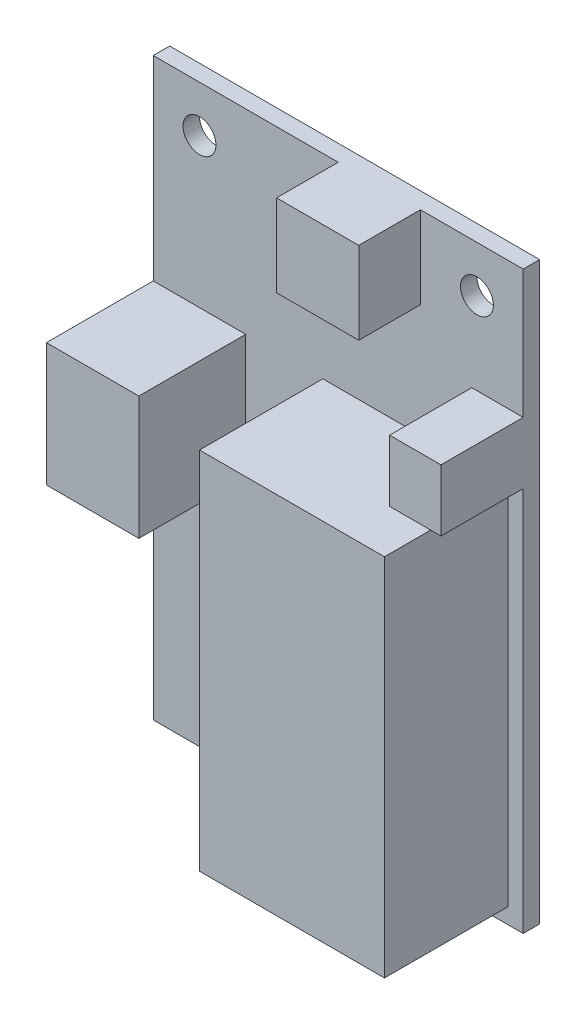
ISO-10303-21;
HEADER;
FILE_DESCRIPTION(('STEP AP214'),'2;1');
FILE_NAME('part.step','',(''),(''),'','','');
FILE_SCHEMA(('AUTOMOTIVE_DESIGN { 1 0 10303 214 1 1 1 1 }'));
ENDSEC;
DATA;
#1=APPLICATION_CONTEXT('core data for automotive mechanical design processes');
#2=APPLICATION_PROTOCOL_DEFINITION('international standard','automotive_design',2000,#1);
#3=PRODUCT_CONTEXT('',#1,'mechanical');
#4=PRODUCT('Part','Part','',(#3));
#5=PRODUCT_RELATED_PRODUCT_CATEGORY('part','',(#4));
#6=PRODUCT_DEFINITION_FORMATION('','',#4);
#7=PRODUCT_DEFINITION_CONTEXT('part definition',#1,'design');
#8=PRODUCT_DEFINITION('design','',#6,#7);
#9=PRODUCT_DEFINITION_SHAPE('','',#8);
#10=(LENGTH_UNIT() NAMED_UNIT(*) SI_UNIT(.MILLI.,.METRE.));
#11=(NAMED_UNIT(*) PLANE_ANGLE_UNIT() SI_UNIT($,.RADIAN.));
#12=(NAMED_UNIT(*) SI_UNIT($,.STERADIAN.) SOLID_ANGLE_UNIT());
#13=UNCERTAINTY_MEASURE_WITH_UNIT(LENGTH_MEASURE(1.E-05),#10,'distance_accuracy_value','');
#14=(GEOMETRIC_REPRESENTATION_CONTEXT(3) GLOBAL_UNCERTAINTY_ASSIGNED_CONTEXT((#13)) GLOBAL_UNIT_ASSIGNED_CONTEXT((#10,
#11,#12)) REPRESENTATION_CONTEXT('',''));
#15=CARTESIAN_POINT('',(0.,0.,0.));
#16=DIRECTION('',(0.,0.,1.));
#17=DIRECTION('',(1.,0.,0.));
#18=AXIS2_PLACEMENT_3D('',#15,#16,#17);
#19=CARTESIAN_POINT('',(0.,0.,1.6));
#20=DIRECTION('',(0.,0.,1.));
#21=DIRECTION('',(1.,0.,0.));
#22=AXIS2_PLACEMENT_3D('',#19,#20,#21);
#23=PLANE('',#22);
#24=CARTESIAN_POINT('',(-31.5,51.5,1.6));
#25=DIRECTION('',(0.,0.,1.));
#26=DIRECTION('',(1.,0.,0.));
#27=AXIS2_PLACEMENT_3D('',#24,#25,#26);
#28=CIRCLE('',#27,1.6);
#29=CARTESIAN_POINT('',(-29.9,51.5,1.6));
#30=VERTEX_POINT('',#29);
#31=EDGE_CURVE('E342',#30,#30,#28,.T.);
#32=ORIENTED_EDGE('',*,*,#31,.F.);
#33=EDGE_LOOP('',(#32));
#34=FACE_BOUND('',#33,.T.);
#35=CARTESIAN_POINT('',(-4.49999999999998,51.5,1.6));
#36=DIRECTION('',(0.,0.,1.));
#37=DIRECTION('',(1.,0.,0.));
#38=AXIS2_PLACEMENT_3D('',#35,#36,#37);
#39=CIRCLE('',#38,1.6);
#40=CARTESIAN_POINT('',(-2.89999999999999,51.5,1.6));
#41=VERTEX_POINT('',#40);
#42=EDGE_CURVE('E334',#41,#41,#39,.T.);
#43=ORIENTED_EDGE('',*,*,#42,.F.);
#44=EDGE_LOOP('',(#43));
#45=FACE_BOUND('',#44,.T.);
#46=DIRECTION('',(1.,0.,0.));
#47=VECTOR('',#46,1.);
#48=CARTESIAN_POINT('',(-19.5,1.50000000000001,1.6));
#49=LINE('',#48,#47);
#50=CARTESIAN_POINT('',(-19.5,1.50000000000001,1.6));
#51=VERTEX_POINT('',#50);
#52=CARTESIAN_POINT('',(-1.49999999999998,1.50000000000001,1.6));
#53=VERTEX_POINT('',#52);
#54=EDGE_CURVE('E209',#51,#53,#49,.T.);
#55=ORIENTED_EDGE('',*,*,#54,.F.);
#56=DIRECTION('',(0.,-1.,0.));
#57=VECTOR('',#56,1.);
#58=CARTESIAN_POINT('',(-19.5,37.,1.6));
#59=LINE('',#58,#57);
#60=CARTESIAN_POINT('',(-19.5,37.,1.6));
#61=VERTEX_POINT('',#60);
#62=EDGE_CURVE('E204',#61,#51,#59,.T.);
#63=ORIENTED_EDGE('',*,*,#62,.F.);
#64=DIRECTION('',(-1.,0.,0.));
#65=VECTOR('',#64,1.);
#66=CARTESIAN_POINT('',(-19.5,37.,1.6));
#67=LINE('',#66,#65);
#68=CARTESIAN_POINT('',(-1.49999999999998,37.,1.6));
#69=VERTEX_POINT('',#68);
#70=EDGE_CURVE('E220',#69,#61,#67,.T.);
#71=ORIENTED_EDGE('',*,*,#70,.F.);
#72=DIRECTION('',(0.,1.,0.));
#73=VECTOR('',#72,1.);
#74=CARTESIAN_POINT('',(-1.49999999999998,37.,1.6));
#75=LINE('',#74,#73);
#76=EDGE_CURVE('E232',#53,#69,#75,.T.);
#77=ORIENTED_EDGE('',*,*,#76,.F.);
#78=EDGE_LOOP('',(#55,#63,#71,#77));
#79=FACE_BOUND('',#78,.T.);
#80=DIRECTION('',(0.,1.,0.));
#81=VECTOR('',#80,1.);
#82=CARTESIAN_POINT('',(-27.,37.,1.6));
#83=LINE('',#82,#81);
#84=CARTESIAN_POINT('',(-27.,25.,1.6));
#85=VERTEX_POINT('',#84);
#86=CARTESIAN_POINT('',(-27.,37.,1.6));
#87=VERTEX_POINT('',#86);
#88=EDGE_CURVE('E57',#85,#87,#83,.T.);
#89=ORIENTED_EDGE('',*,*,#88,.F.);
#90=DIRECTION('',(1.,0.,0.));
#91=VECTOR('',#90,1.);
#92=CARTESIAN_POINT('',(-36.,25.,1.6));
#93=LINE('',#92,#91);
#94=CARTESIAN_POINT('',(-36.,25.,1.6));
#95=VERTEX_POINT('',#94);
#96=EDGE_CURVE('E411',#95,#85,#93,.T.);
#97=ORIENTED_EDGE('',*,*,#96,.F.);
#98=DIRECTION('',(0.,-1.,0.));
#99=VECTOR('',#98,1.);
#100=CARTESIAN_POINT('',(-36.,56.,1.6));
#101=LINE('',#100,#99);
#102=CARTESIAN_POINT('',(-36.,0.,1.6));
#103=VERTEX_POINT('',#102);
#104=EDGE_CURVE('E202',#95,#103,#101,.T.);
#105=ORIENTED_EDGE('',*,*,#104,.T.);
#106=DIRECTION('',(1.,0.,0.));
#107=VECTOR('',#106,1.);
#108=CARTESIAN_POINT('',(-36.,0.,1.6));
#109=LINE('',#108,#107);
#110=CARTESIAN_POINT('',(0.,0.,1.6));
#111=VERTEX_POINT('',#110);
#112=EDGE_CURVE('E353',#103,#111,#109,.T.);
#113=ORIENTED_EDGE('',*,*,#112,.T.);
#114=DIRECTION('',(0.,1.,0.));
#115=VECTOR('',#114,1.);
#116=CARTESIAN_POINT('',(0.,56.,1.6));
#117=LINE('',#116,#115);
#118=CARTESIAN_POINT('',(0.,37.5,1.6));
#119=VERTEX_POINT('',#118);
#120=EDGE_CURVE('E357',#111,#119,#117,.T.);
#121=ORIENTED_EDGE('',*,*,#120,.T.);
#122=DIRECTION('',(1.,0.,0.));
#123=VECTOR('',#122,1.);
#124=CARTESIAN_POINT('',(0.,37.5,1.6));
#125=LINE('',#124,#123);
#126=CARTESIAN_POINT('',(-5.,37.5,1.6));
#127=VERTEX_POINT('',#126);
#128=EDGE_CURVE('E257',#127,#119,#125,.T.);
#129=ORIENTED_EDGE('',*,*,#128,.F.);
#130=DIRECTION('',(0.,-1.,0.));
#131=VECTOR('',#130,1.);
#132=CARTESIAN_POINT('',(-5.,43.5,1.6));
#133=LINE('',#132,#131);
#134=CARTESIAN_POINT('',(-5.,43.5,1.6));
#135=VERTEX_POINT('',#134);
#136=EDGE_CURVE('E270',#135,#127,#133,.T.);
#137=ORIENTED_EDGE('',*,*,#136,.F.);
#138=DIRECTION('',(-1.,0.,0.));
#139=VECTOR('',#138,1.);
#140=CARTESIAN_POINT('',(0.,43.5,1.6));
#141=LINE('',#140,#139);
#142=CARTESIAN_POINT('',(0.,43.5,1.6));
#143=VERTEX_POINT('',#142);
#144=EDGE_CURVE('E251',#143,#135,#141,.T.);
#145=ORIENTED_EDGE('',*,*,#144,.F.);
#146=CARTESIAN_POINT('',(0.,56.,1.6));
#147=VERTEX_POINT('',#146);
#148=EDGE_CURVE('E356',#143,#147,#117,.T.);
#149=ORIENTED_EDGE('',*,*,#148,.T.);
#150=DIRECTION('',(-1.,0.,0.));
#151=VECTOR('',#150,1.);
#152=CARTESIAN_POINT('',(-36.,56.,1.6));
#153=LINE('',#152,#151);
#154=CARTESIAN_POINT('',(-9.99999999999998,56.,1.6));
#155=VERTEX_POINT('',#154);
#156=EDGE_CURVE('E361',#147,#155,#153,.T.);
#157=ORIENTED_EDGE('',*,*,#156,.T.);
#158=DIRECTION('',(0.,1.,0.));
#159=VECTOR('',#158,1.);
#160=CARTESIAN_POINT('',(-9.99999999999998,56.,1.6));
#161=LINE('',#160,#159);
#162=CARTESIAN_POINT('',(-9.99999999999998,48.,1.6));
#163=VERTEX_POINT('',#162);
#164=EDGE_CURVE('E298',#163,#155,#161,.T.);
#165=ORIENTED_EDGE('',*,*,#164,.F.);
#166=DIRECTION('',(1.,0.,0.));
#167=VECTOR('',#166,1.);
#168=CARTESIAN_POINT('',(-18.,48.,1.6));
#169=LINE('',#168,#167);
#170=CARTESIAN_POINT('',(-18.,48.,1.6));
#171=VERTEX_POINT('',#170);
#172=EDGE_CURVE('E311',#171,#163,#169,.T.);
#173=ORIENTED_EDGE('',*,*,#172,.F.);
#174=DIRECTION('',(0.,-1.,0.));
#175=VECTOR('',#174,1.);
#176=CARTESIAN_POINT('',(-18.,56.,1.6));
#177=LINE('',#176,#175);
#178=CARTESIAN_POINT('',(-18.,56.,1.6));
#179=VERTEX_POINT('',#178);
#180=EDGE_CURVE('E292',#179,#171,#177,.T.);
#181=ORIENTED_EDGE('',*,*,#180,.F.);
#182=CARTESIAN_POINT('',(-36.,56.,1.6));
#183=VERTEX_POINT('',#182);
#184=EDGE_CURVE('E360',#179,#183,#153,.T.);
#185=ORIENTED_EDGE('',*,*,#184,.T.);
#186=CARTESIAN_POINT('',(-36.,37.,1.6));
#187=VERTEX_POINT('',#186);
#188=EDGE_CURVE('E350',#183,#187,#101,.T.);
#189=ORIENTED_EDGE('',*,*,#188,.T.);
#190=DIRECTION('',(-1.,0.,0.));
#191=VECTOR('',#190,1.);
#192=CARTESIAN_POINT('',(-36.,37.,1.6));
#193=LINE('',#192,#191);
#194=EDGE_CURVE('E62',#87,#187,#193,.T.);
#195=ORIENTED_EDGE('',*,*,#194,.F.);
#196=EDGE_LOOP('',(#89,#97,#105,#113,#121,#129,#137,#145,#149,#157,#165,#173,#181,#185,#189,#195));
#197=FACE_BOUND('',#196,.T.);
#198=ADVANCED_FACE('F41',(#34,#45,#79,#197),#23,.T.);
#199=CARTESIAN_POINT('',(0.,0.,0.));
#200=DIRECTION('',(0.,0.,1.));
#201=DIRECTION('',(1.,0.,0.));
#202=AXIS2_PLACEMENT_3D('',#199,#200,#201);
#203=PLANE('',#202);
#204=DIRECTION('',(0.,-1.,0.));
#205=VECTOR('',#204,1.);
#206=CARTESIAN_POINT('',(-36.,56.,0.));
#207=LINE('',#206,#205);
#208=CARTESIAN_POINT('',(-36.,56.,0.));
#209=VERTEX_POINT('',#208);
#210=CARTESIAN_POINT('',(-36.,0.,0.));
#211=VERTEX_POINT('',#210);
#212=EDGE_CURVE('E346',#209,#211,#207,.T.);
#213=ORIENTED_EDGE('',*,*,#212,.F.);
#214=DIRECTION('',(-1.,0.,0.));
#215=VECTOR('',#214,1.);
#216=CARTESIAN_POINT('',(-36.,56.,0.));
#217=LINE('',#216,#215);
#218=CARTESIAN_POINT('',(0.,56.,0.));
#219=VERTEX_POINT('',#218);
#220=EDGE_CURVE('E373',#219,#209,#217,.T.);
#221=ORIENTED_EDGE('',*,*,#220,.F.);
#222=DIRECTION('',(0.,1.,0.));
#223=VECTOR('',#222,1.);
#224=CARTESIAN_POINT('',(0.,56.,0.));
#225=LINE('',#224,#223);
#226=CARTESIAN_POINT('',(0.,0.,0.));
#227=VERTEX_POINT('',#226);
#228=EDGE_CURVE('E370',#227,#219,#225,.T.);
#229=ORIENTED_EDGE('',*,*,#228,.F.);
#230=DIRECTION('',(1.,0.,0.));
#231=VECTOR('',#230,1.);
#232=CARTESIAN_POINT('',(-36.,0.,0.));
#233=LINE('',#232,#231);
#234=EDGE_CURVE('E367',#211,#227,#233,.T.);
#235=ORIENTED_EDGE('',*,*,#234,.F.);
#236=EDGE_LOOP('',(#213,#221,#229,#235));
#237=FACE_BOUND('',#236,.T.);
#238=CARTESIAN_POINT('',(-31.5,51.5,0.));
#239=DIRECTION('',(0.,0.,1.));
#240=DIRECTION('',(1.,0.,0.));
#241=AXIS2_PLACEMENT_3D('',#238,#239,#240);
#242=CIRCLE('',#241,1.6);
#243=CARTESIAN_POINT('',(-29.9,51.5,0.));
#244=VERTEX_POINT('',#243);
#245=EDGE_CURVE('E338',#244,#244,#242,.T.);
#246=ORIENTED_EDGE('',*,*,#245,.T.);
#247=EDGE_LOOP('',(#246));
#248=FACE_BOUND('',#247,.T.);
#249=CARTESIAN_POINT('',(-4.49999999999998,51.5,0.));
#250=DIRECTION('',(0.,0.,1.));
#251=DIRECTION('',(1.,0.,0.));
#252=AXIS2_PLACEMENT_3D('',#249,#250,#251);
#253=CIRCLE('',#252,1.6);
#254=CARTESIAN_POINT('',(-2.89999999999999,51.5,0.));
#255=VERTEX_POINT('',#254);
#256=EDGE_CURVE('E333',#255,#255,#253,.T.);
#257=ORIENTED_EDGE('',*,*,#256,.T.);
#258=EDGE_LOOP('',(#257));
#259=FACE_BOUND('',#258,.T.);
#260=ADVANCED_FACE('F395',(#237,#248,#259),#203,.F.);
#261=CARTESIAN_POINT('',(-36.,56.,1.6));
#262=DIRECTION('',(1.,0.,0.));
#263=DIRECTION('',(0.,1.,0.));
#264=AXIS2_PLACEMENT_3D('',#261,#262,#263);
#265=PLANE('',#264);
#266=ORIENTED_EDGE('',*,*,#212,.T.);
#267=DIRECTION('',(0.,0.,-1.));
#268=VECTOR('',#267,1.);
#269=CARTESIAN_POINT('',(-36.,0.,1.6));
#270=LINE('',#269,#268);
#271=EDGE_CURVE('E11',#103,#211,#270,.T.);
#272=ORIENTED_EDGE('',*,*,#271,.F.);
#273=ORIENTED_EDGE('',*,*,#104,.F.);
#274=DIRECTION('',(0.,0.,-1.));
#275=VECTOR('',#274,1.);
#276=CARTESIAN_POINT('',(-36.,25.,12.));
#277=LINE('',#276,#275);
#278=CARTESIAN_POINT('',(-36.,25.,12.));
#279=VERTEX_POINT('',#278);
#280=EDGE_CURVE('E182',#279,#95,#277,.T.);
#281=ORIENTED_EDGE('',*,*,#280,.F.);
#282=DIRECTION('',(0.,-1.,0.));
#283=VECTOR('',#282,1.);
#284=CARTESIAN_POINT('',(-36.,37.,12.));
#285=LINE('',#284,#283);
#286=CARTESIAN_POINT('',(-36.,37.,12.));
#287=VERTEX_POINT('',#286);
#288=EDGE_CURVE('E189',#287,#279,#285,.T.);
#289=ORIENTED_EDGE('',*,*,#288,.F.);
#290=DIRECTION('',(0.,0.,-1.));
#291=VECTOR('',#290,1.);
#292=CARTESIAN_POINT('',(-36.,37.,12.));
#293=LINE('',#292,#291);
#294=EDGE_CURVE('E403',#287,#187,#293,.T.);
#295=ORIENTED_EDGE('',*,*,#294,.T.);
#296=ORIENTED_EDGE('',*,*,#188,.F.);
#297=DIRECTION('',(0.,0.,-1.));
#298=VECTOR('',#297,1.);
#299=CARTESIAN_POINT('',(-36.,56.,1.6));
#300=LINE('',#299,#298);
#301=EDGE_CURVE('E364',#183,#209,#300,.T.);
#302=ORIENTED_EDGE('',*,*,#301,.T.);
#303=EDGE_LOOP('',(#266,#272,#273,#281,#289,#295,#296,#302));
#304=FACE_BOUND('',#303,.T.);
#305=ADVANCED_FACE('F43',(#304),#265,.F.);
#306=CARTESIAN_POINT('',(-36.,0.,1.6));
#307=DIRECTION('',(0.,1.,0.));
#308=DIRECTION('',(0.,0.,1.));
#309=AXIS2_PLACEMENT_3D('',#306,#307,#308);
#310=PLANE('',#309);
#311=ORIENTED_EDGE('',*,*,#234,.T.);
#312=DIRECTION('',(0.,0.,-1.));
#313=VECTOR('',#312,1.);
#314=CARTESIAN_POINT('',(0.,0.,1.6));
#315=LINE('',#314,#313);
#316=EDGE_CURVE('E50',#111,#227,#315,.T.);
#317=ORIENTED_EDGE('',*,*,#316,.F.);
#318=ORIENTED_EDGE('',*,*,#112,.F.);
#319=ORIENTED_EDGE('',*,*,#271,.T.);
#320=EDGE_LOOP('',(#311,#317,#318,#319));
#321=FACE_BOUND('',#320,.T.);
#322=ADVANCED_FACE('F449',(#321),#310,.F.);
#323=CARTESIAN_POINT('',(0.,56.,1.6));
#324=DIRECTION('',(-1.,0.,0.));
#325=DIRECTION('',(0.,-1.,0.));
#326=AXIS2_PLACEMENT_3D('',#323,#324,#325);
#327=PLANE('',#326);
#328=ORIENTED_EDGE('',*,*,#228,.T.);
#329=DIRECTION('',(0.,0.,-1.));
#330=VECTOR('',#329,1.);
#331=CARTESIAN_POINT('',(0.,56.,1.6));
#332=LINE('',#331,#330);
#333=EDGE_CURVE('E379',#147,#219,#332,.T.);
#334=ORIENTED_EDGE('',*,*,#333,.F.);
#335=ORIENTED_EDGE('',*,*,#148,.F.);
#336=DIRECTION('',(0.,0.,-1.));
#337=VECTOR('',#336,1.);
#338=CARTESIAN_POINT('',(0.,43.5,9.6));
#339=LINE('',#338,#337);
#340=CARTESIAN_POINT('',(0.,43.5,9.6));
#341=VERTEX_POINT('',#340);
#342=EDGE_CURVE('E288',#341,#143,#339,.T.);
#343=ORIENTED_EDGE('',*,*,#342,.F.);
#344=DIRECTION('',(0.,1.,0.));
#345=VECTOR('',#344,1.);
#346=CARTESIAN_POINT('',(0.,43.5,9.6));
#347=LINE('',#346,#345);
#348=CARTESIAN_POINT('',(0.,37.5,9.6));
#349=VERTEX_POINT('',#348);
#350=EDGE_CURVE('E252',#349,#341,#347,.T.);
#351=ORIENTED_EDGE('',*,*,#350,.F.);
#352=DIRECTION('',(0.,0.,-1.));
#353=VECTOR('',#352,1.);
#354=CARTESIAN_POINT('',(0.,37.5,9.6));
#355=LINE('',#354,#353);
#356=EDGE_CURVE('E266',#349,#119,#355,.T.);
#357=ORIENTED_EDGE('',*,*,#356,.T.);
#358=ORIENTED_EDGE('',*,*,#120,.F.);
#359=ORIENTED_EDGE('',*,*,#316,.T.);
#360=EDGE_LOOP('',(#328,#334,#335,#343,#351,#357,#358,#359));
#361=FACE_BOUND('',#360,.T.);
#362=ADVANCED_FACE('F388',(#361),#327,.F.);
#363=CARTESIAN_POINT('',(-36.,56.,1.6));
#364=DIRECTION('',(0.,-1.,0.));
#365=DIRECTION('',(0.,0.,-1.));
#366=AXIS2_PLACEMENT_3D('',#363,#364,#365);
#367=PLANE('',#366);
#368=ORIENTED_EDGE('',*,*,#220,.T.);
#369=ORIENTED_EDGE('',*,*,#301,.F.);
#370=ORIENTED_EDGE('',*,*,#184,.F.);
#371=DIRECTION('',(0.,0.,-1.));
#372=VECTOR('',#371,1.);
#373=CARTESIAN_POINT('',(-18.,56.,7.6));
#374=LINE('',#373,#372);
#375=CARTESIAN_POINT('',(-18.,56.,7.6));
#376=VERTEX_POINT('',#375);
#377=EDGE_CURVE('E307',#376,#179,#374,.T.);
#378=ORIENTED_EDGE('',*,*,#377,.F.);
#379=DIRECTION('',(-1.,0.,0.));
#380=VECTOR('',#379,1.);
#381=CARTESIAN_POINT('',(-18.,56.,7.6));
#382=LINE('',#381,#380);
#383=CARTESIAN_POINT('',(-9.99999999999998,56.,7.6));
#384=VERTEX_POINT('',#383);
#385=EDGE_CURVE('E304',#384,#376,#382,.T.);
#386=ORIENTED_EDGE('',*,*,#385,.F.);
#387=DIRECTION('',(0.,0.,-1.));
#388=VECTOR('',#387,1.);
#389=CARTESIAN_POINT('',(-9.99999999999998,56.,7.6));
#390=LINE('',#389,#388);
#391=EDGE_CURVE('E321',#384,#155,#390,.T.);
#392=ORIENTED_EDGE('',*,*,#391,.T.);
#393=ORIENTED_EDGE('',*,*,#156,.F.);
#394=ORIENTED_EDGE('',*,*,#333,.T.);
#395=EDGE_LOOP('',(#368,#369,#370,#378,#386,#392,#393,#394));
#396=FACE_BOUND('',#395,.T.);
#397=ADVANCED_FACE('F399',(#396),#367,.F.);
#398=CARTESIAN_POINT('',(-31.5,51.5,1.6));
#399=DIRECTION('',(0.,0.,-1.));
#400=DIRECTION('',(-1.,0.,0.));
#401=AXIS2_PLACEMENT_3D('',#398,#399,#400);
#402=CYLINDRICAL_SURFACE('',#401,1.6);
#403=ORIENTED_EDGE('',*,*,#31,.T.);
#404=EDGE_LOOP('',(#403));
#405=FACE_BOUND('',#404,.T.);
#406=ORIENTED_EDGE('',*,*,#245,.F.);
#407=EDGE_LOOP('',(#406));
#408=FACE_BOUND('',#407,.T.);
#409=ADVANCED_FACE('F443',(#405,#408),#402,.F.);
#410=CARTESIAN_POINT('',(-4.49999999999998,51.5,1.6));
#411=DIRECTION('',(0.,0.,-1.));
#412=DIRECTION('',(-1.,0.,0.));
#413=AXIS2_PLACEMENT_3D('',#410,#411,#412);
#414=CYLINDRICAL_SURFACE('',#413,1.6);
#415=ORIENTED_EDGE('',*,*,#42,.T.);
#416=EDGE_LOOP('',(#415));
#417=FACE_BOUND('',#416,.T.);
#418=ORIENTED_EDGE('',*,*,#256,.F.);
#419=EDGE_LOOP('',(#418));
#420=FACE_BOUND('',#419,.T.);
#421=ADVANCED_FACE('F490',(#417,#420),#414,.F.);
#422=CARTESIAN_POINT('',(-18.,56.,7.6));
#423=DIRECTION('',(1.,0.,0.));
#424=DIRECTION('',(0.,1.,0.));
#425=AXIS2_PLACEMENT_3D('',#422,#423,#424);
#426=PLANE('',#425);
#427=ORIENTED_EDGE('',*,*,#180,.T.);
#428=DIRECTION('',(0.,0.,-1.));
#429=VECTOR('',#428,1.);
#430=CARTESIAN_POINT('',(-18.,48.,7.6));
#431=LINE('',#430,#429);
#432=CARTESIAN_POINT('',(-18.,48.,7.6));
#433=VERTEX_POINT('',#432);
#434=EDGE_CURVE('E329',#433,#171,#431,.T.);
#435=ORIENTED_EDGE('',*,*,#434,.F.);
#436=DIRECTION('',(0.,-1.,0.));
#437=VECTOR('',#436,1.);
#438=CARTESIAN_POINT('',(-18.,56.,7.6));
#439=LINE('',#438,#437);
#440=EDGE_CURVE('E293',#376,#433,#439,.T.);
#441=ORIENTED_EDGE('',*,*,#440,.F.);
#442=ORIENTED_EDGE('',*,*,#377,.T.);
#443=EDGE_LOOP('',(#427,#435,#441,#442));
#444=FACE_BOUND('',#443,.T.);
#445=ADVANCED_FACE('F471',(#444),#426,.F.);
#446=CARTESIAN_POINT('',(-18.,48.,7.6));
#447=DIRECTION('',(0.,1.,0.));
#448=DIRECTION('',(0.,0.,1.));
#449=AXIS2_PLACEMENT_3D('',#446,#447,#448);
#450=PLANE('',#449);
#451=ORIENTED_EDGE('',*,*,#172,.T.);
#452=DIRECTION('',(0.,0.,-1.));
#453=VECTOR('',#452,1.);
#454=CARTESIAN_POINT('',(-9.99999999999998,48.,7.6));
#455=LINE('',#454,#453);
#456=CARTESIAN_POINT('',(-9.99999999999998,48.,7.6));
#457=VERTEX_POINT('',#456);
#458=EDGE_CURVE('E325',#457,#163,#455,.T.);
#459=ORIENTED_EDGE('',*,*,#458,.F.);
#460=DIRECTION('',(1.,0.,0.));
#461=VECTOR('',#460,1.);
#462=CARTESIAN_POINT('',(-18.,48.,7.6));
#463=LINE('',#462,#461);
#464=EDGE_CURVE('E297',#433,#457,#463,.T.);
#465=ORIENTED_EDGE('',*,*,#464,.F.);
#466=ORIENTED_EDGE('',*,*,#434,.T.);
#467=EDGE_LOOP('',(#451,#459,#465,#466));
#468=FACE_BOUND('',#467,.T.);
#469=ADVANCED_FACE('F467',(#468),#450,.F.);
#470=CARTESIAN_POINT('',(-9.99999999999998,56.,7.6));
#471=DIRECTION('',(-1.,0.,0.));
#472=DIRECTION('',(0.,-1.,0.));
#473=AXIS2_PLACEMENT_3D('',#470,#471,#472);
#474=PLANE('',#473);
#475=ORIENTED_EDGE('',*,*,#164,.T.);
#476=ORIENTED_EDGE('',*,*,#391,.F.);
#477=DIRECTION('',(0.,1.,0.));
#478=VECTOR('',#477,1.);
#479=CARTESIAN_POINT('',(-9.99999999999998,56.,7.6));
#480=LINE('',#479,#478);
#481=EDGE_CURVE('E301',#457,#384,#480,.T.);
#482=ORIENTED_EDGE('',*,*,#481,.F.);
#483=ORIENTED_EDGE('',*,*,#458,.T.);
#484=EDGE_LOOP('',(#475,#476,#482,#483));
#485=FACE_BOUND('',#484,.T.);
#486=ADVANCED_FACE('F464',(#485),#474,.F.);
#487=CARTESIAN_POINT('',(0.,0.,7.6));
#488=DIRECTION('',(0.,0.,1.));
#489=DIRECTION('',(1.,0.,0.));
#490=AXIS2_PLACEMENT_3D('',#487,#488,#489);
#491=PLANE('',#490);
#492=ORIENTED_EDGE('',*,*,#440,.T.);
#493=ORIENTED_EDGE('',*,*,#464,.T.);
#494=ORIENTED_EDGE('',*,*,#481,.T.);
#495=ORIENTED_EDGE('',*,*,#385,.T.);
#496=EDGE_LOOP('',(#492,#493,#494,#495));
#497=FACE_BOUND('',#496,.T.);
#498=ADVANCED_FACE('F473',(#497),#491,.T.);
#499=CARTESIAN_POINT('',(0.,43.5,9.6));
#500=DIRECTION('',(0.,-1.,0.));
#501=DIRECTION('',(0.,0.,-1.));
#502=AXIS2_PLACEMENT_3D('',#499,#500,#501);
#503=PLANE('',#502);
#504=ORIENTED_EDGE('',*,*,#144,.T.);
#505=DIRECTION('',(0.,0.,-1.));
#506=VECTOR('',#505,1.);
#507=CARTESIAN_POINT('',(-5.,43.5,9.6));
#508=LINE('',#507,#506);
#509=CARTESIAN_POINT('',(-5.,43.5,9.6));
#510=VERTEX_POINT('',#509);
#511=EDGE_CURVE('E284',#510,#135,#508,.T.);
#512=ORIENTED_EDGE('',*,*,#511,.F.);
#513=DIRECTION('',(-1.,0.,0.));
#514=VECTOR('',#513,1.);
#515=CARTESIAN_POINT('',(0.,43.5,9.6));
#516=LINE('',#515,#514);
#517=EDGE_CURVE('E256',#341,#510,#516,.T.);
#518=ORIENTED_EDGE('',*,*,#517,.F.);
#519=ORIENTED_EDGE('',*,*,#342,.T.);
#520=EDGE_LOOP('',(#504,#512,#518,#519));
#521=FACE_BOUND('',#520,.T.);
#522=ADVANCED_FACE('F475',(#521),#503,.F.);
#523=CARTESIAN_POINT('',(-5.,43.5,9.6));
#524=DIRECTION('',(1.,0.,0.));
#525=DIRECTION('',(0.,1.,0.));
#526=AXIS2_PLACEMENT_3D('',#523,#524,#525);
#527=PLANE('',#526);
#528=ORIENTED_EDGE('',*,*,#136,.T.);
#529=DIRECTION('',(0.,0.,-1.));
#530=VECTOR('',#529,1.);
#531=CARTESIAN_POINT('',(-5.,37.5,9.6));
#532=LINE('',#531,#530);
#533=CARTESIAN_POINT('',(-5.,37.5,9.6));
#534=VERTEX_POINT('',#533);
#535=EDGE_CURVE('E280',#534,#127,#532,.T.);
#536=ORIENTED_EDGE('',*,*,#535,.F.);
#537=DIRECTION('',(0.,-1.,0.));
#538=VECTOR('',#537,1.);
#539=CARTESIAN_POINT('',(-5.,43.5,9.6));
#540=LINE('',#539,#538);
#541=EDGE_CURVE('E260',#510,#534,#540,.T.);
#542=ORIENTED_EDGE('',*,*,#541,.F.);
#543=ORIENTED_EDGE('',*,*,#511,.T.);
#544=EDGE_LOOP('',(#528,#536,#542,#543));
#545=FACE_BOUND('',#544,.T.);
#546=ADVANCED_FACE('F481',(#545),#527,.F.);
#547=CARTESIAN_POINT('',(0.,37.5,9.6));
#548=DIRECTION('',(0.,1.,0.));
#549=DIRECTION('',(0.,0.,1.));
#550=AXIS2_PLACEMENT_3D('',#547,#548,#549);
#551=PLANE('',#550);
#552=ORIENTED_EDGE('',*,*,#128,.T.);
#553=ORIENTED_EDGE('',*,*,#356,.F.);
#554=DIRECTION('',(1.,0.,0.));
#555=VECTOR('',#554,1.);
#556=CARTESIAN_POINT('',(0.,37.5,9.6));
#557=LINE('',#556,#555);
#558=EDGE_CURVE('E263',#534,#349,#557,.T.);
#559=ORIENTED_EDGE('',*,*,#558,.F.);
#560=ORIENTED_EDGE('',*,*,#535,.T.);
#561=EDGE_LOOP('',(#552,#553,#559,#560));
#562=FACE_BOUND('',#561,.T.);
#563=ADVANCED_FACE('F538',(#562),#551,.F.);
#564=CARTESIAN_POINT('',(0.,0.,9.6));
#565=DIRECTION('',(0.,0.,-1.));
#566=DIRECTION('',(-1.,0.,0.));
#567=AXIS2_PLACEMENT_3D('',#564,#565,#566);
#568=PLANE('',#567);
#569=ORIENTED_EDGE('',*,*,#350,.T.);
#570=ORIENTED_EDGE('',*,*,#517,.T.);
#571=ORIENTED_EDGE('',*,*,#541,.T.);
#572=ORIENTED_EDGE('',*,*,#558,.T.);
#573=EDGE_LOOP('',(#569,#570,#571,#572));
#574=FACE_BOUND('',#573,.T.);
#575=ADVANCED_FACE('F535',(#574),#568,.F.);
#576=CARTESIAN_POINT('',(-19.5,37.,13.6));
#577=DIRECTION('',(1.,0.,0.));
#578=DIRECTION('',(0.,1.,0.));
#579=AXIS2_PLACEMENT_3D('',#576,#577,#578);
#580=PLANE('',#579);
#581=ORIENTED_EDGE('',*,*,#62,.T.);
#582=DIRECTION('',(0.,0.,-1.));
#583=VECTOR('',#582,1.);
#584=CARTESIAN_POINT('',(-19.5,1.50000000000001,13.6));
#585=LINE('',#584,#583);
#586=CARTESIAN_POINT('',(-19.5,1.50000000000001,13.6));
#587=VERTEX_POINT('',#586);
#588=EDGE_CURVE('E248',#587,#51,#585,.T.);
#589=ORIENTED_EDGE('',*,*,#588,.F.);
#590=DIRECTION('',(0.,-1.,0.));
#591=VECTOR('',#590,1.);
#592=CARTESIAN_POINT('',(-19.5,37.,13.6));
#593=LINE('',#592,#591);
#594=CARTESIAN_POINT('',(-19.5,37.,13.6));
#595=VERTEX_POINT('',#594);
#596=EDGE_CURVE('E215',#595,#587,#593,.T.);
#597=ORIENTED_EDGE('',*,*,#596,.F.);
#598=DIRECTION('',(0.,0.,-1.));
#599=VECTOR('',#598,1.);
#600=CARTESIAN_POINT('',(-19.5,37.,13.6));
#601=LINE('',#600,#599);
#602=EDGE_CURVE('E228',#595,#61,#601,.T.);
#603=ORIENTED_EDGE('',*,*,#602,.T.);
#604=EDGE_LOOP('',(#581,#589,#597,#603));
#605=FACE_BOUND('',#604,.T.);
#606=ADVANCED_FACE('F519',(#605),#580,.F.);
#607=CARTESIAN_POINT('',(-19.5,1.50000000000001,13.6));
#608=DIRECTION('',(0.,1.,0.));
#609=DIRECTION('',(0.,0.,1.));
#610=AXIS2_PLACEMENT_3D('',#607,#608,#609);
#611=PLANE('',#610);
#612=ORIENTED_EDGE('',*,*,#54,.T.);
#613=DIRECTION('',(0.,0.,-1.));
#614=VECTOR('',#613,1.);
#615=CARTESIAN_POINT('',(-1.49999999999998,1.50000000000001,13.6));
#616=LINE('',#615,#614);
#617=CARTESIAN_POINT('',(-1.49999999999998,1.50000000000001,13.6));
#618=VERTEX_POINT('',#617);
#619=EDGE_CURVE('E244',#618,#53,#616,.T.);
#620=ORIENTED_EDGE('',*,*,#619,.F.);
#621=DIRECTION('',(1.,0.,0.));
#622=VECTOR('',#621,1.);
#623=CARTESIAN_POINT('',(-19.5,1.50000000000001,13.6));
#624=LINE('',#623,#622);
#625=EDGE_CURVE('E219',#587,#618,#624,.T.);
#626=ORIENTED_EDGE('',*,*,#625,.F.);
#627=ORIENTED_EDGE('',*,*,#588,.T.);
#628=EDGE_LOOP('',(#612,#620,#626,#627));
#629=FACE_BOUND('',#628,.T.);
#630=ADVANCED_FACE('F508',(#629),#611,.F.);
#631=CARTESIAN_POINT('',(-1.49999999999998,37.,13.6));
#632=DIRECTION('',(-1.,0.,0.));
#633=DIRECTION('',(0.,0.,1.));
#634=AXIS2_PLACEMENT_3D('',#631,#632,#633);
#635=PLANE('',#634);
#636=ORIENTED_EDGE('',*,*,#76,.T.);
#637=DIRECTION('',(0.,0.,-1.));
#638=VECTOR('',#637,1.);
#639=CARTESIAN_POINT('',(-1.49999999999998,37.,13.6));
#640=LINE('',#639,#638);
#641=CARTESIAN_POINT('',(-1.49999999999998,37.,13.6));
#642=VERTEX_POINT('',#641);
#643=EDGE_CURVE('E241',#642,#69,#640,.T.);
#644=ORIENTED_EDGE('',*,*,#643,.F.);
#645=DIRECTION('',(0.,1.,0.));
#646=VECTOR('',#645,1.);
#647=CARTESIAN_POINT('',(-1.49999999999998,37.,13.6));
#648=LINE('',#647,#646);
#649=EDGE_CURVE('E223',#618,#642,#648,.T.);
#650=ORIENTED_EDGE('',*,*,#649,.F.);
#651=ORIENTED_EDGE('',*,*,#619,.T.);
#652=EDGE_LOOP('',(#636,#644,#650,#651));
#653=FACE_BOUND('',#652,.T.);
#654=ADVANCED_FACE('F512',(#653),#635,.F.);
#655=CARTESIAN_POINT('',(-19.5,37.,13.6));
#656=DIRECTION('',(0.,-1.,0.));
#657=DIRECTION('',(0.,0.,-1.));
#658=AXIS2_PLACEMENT_3D('',#655,#656,#657);
#659=PLANE('',#658);
#660=ORIENTED_EDGE('',*,*,#70,.T.);
#661=ORIENTED_EDGE('',*,*,#602,.F.);
#662=DIRECTION('',(-1.,0.,0.));
#663=VECTOR('',#662,1.);
#664=CARTESIAN_POINT('',(-19.5,37.,13.6));
#665=LINE('',#664,#663);
#666=EDGE_CURVE('E226',#642,#595,#665,.T.);
#667=ORIENTED_EDGE('',*,*,#666,.F.);
#668=ORIENTED_EDGE('',*,*,#643,.T.);
#669=EDGE_LOOP('',(#660,#661,#667,#668));
#670=FACE_BOUND('',#669,.T.);
#671=ADVANCED_FACE('F521',(#670),#659,.F.);
#672=CARTESIAN_POINT('',(0.,0.,13.6));
#673=DIRECTION('',(0.,0.,1.));
#674=DIRECTION('',(1.,0.,0.));
#675=AXIS2_PLACEMENT_3D('',#672,#673,#674);
#676=PLANE('',#675);
#677=ORIENTED_EDGE('',*,*,#596,.T.);
#678=ORIENTED_EDGE('',*,*,#625,.T.);
#679=ORIENTED_EDGE('',*,*,#649,.T.);
#680=ORIENTED_EDGE('',*,*,#666,.T.);
#681=EDGE_LOOP('',(#677,#678,#679,#680));
#682=FACE_BOUND('',#681,.T.);
#683=ADVANCED_FACE('F431',(#682),#676,.T.);
#684=CARTESIAN_POINT('',(-36.,25.,12.));
#685=DIRECTION('',(0.,1.,0.));
#686=DIRECTION('',(0.,0.,1.));
#687=AXIS2_PLACEMENT_3D('',#684,#685,#686);
#688=PLANE('',#687);
#689=ORIENTED_EDGE('',*,*,#96,.T.);
#690=DIRECTION('',(0.,0.,-1.));
#691=VECTOR('',#690,1.);
#692=CARTESIAN_POINT('',(-27.,25.,12.));
#693=LINE('',#692,#691);
#694=CARTESIAN_POINT('',(-27.,25.,12.));
#695=VERTEX_POINT('',#694);
#696=EDGE_CURVE('E184',#695,#85,#693,.T.);
#697=ORIENTED_EDGE('',*,*,#696,.F.);
#698=DIRECTION('',(1.,0.,0.));
#699=VECTOR('',#698,1.);
#700=CARTESIAN_POINT('',(-36.,25.,12.));
#701=LINE('',#700,#699);
#702=EDGE_CURVE('E178',#279,#695,#701,.T.);
#703=ORIENTED_EDGE('',*,*,#702,.F.);
#704=ORIENTED_EDGE('',*,*,#280,.T.);
#705=EDGE_LOOP('',(#689,#697,#703,#704));
#706=FACE_BOUND('',#705,.T.);
#707=ADVANCED_FACE('F180',(#706),#688,.F.);
#708=CARTESIAN_POINT('',(-27.,37.,12.));
#709=DIRECTION('',(-1.,0.,0.));
#710=DIRECTION('',(0.,0.,1.));
#711=AXIS2_PLACEMENT_3D('',#708,#709,#710);
#712=PLANE('',#711);
#713=ORIENTED_EDGE('',*,*,#88,.T.);
#714=DIRECTION('',(0.,0.,-1.));
#715=VECTOR('',#714,1.);
#716=CARTESIAN_POINT('',(-27.,37.,12.));
#717=LINE('',#716,#715);
#718=CARTESIAN_POINT('',(-27.,37.,12.));
#719=VERTEX_POINT('',#718);
#720=EDGE_CURVE('E211',#719,#87,#717,.T.);
#721=ORIENTED_EDGE('',*,*,#720,.F.);
#722=DIRECTION('',(0.,1.,0.));
#723=VECTOR('',#722,1.);
#724=CARTESIAN_POINT('',(-27.,37.,12.));
#725=LINE('',#724,#723);
#726=EDGE_CURVE('E188',#695,#719,#725,.T.);
#727=ORIENTED_EDGE('',*,*,#726,.F.);
#728=ORIENTED_EDGE('',*,*,#696,.T.);
#729=EDGE_LOOP('',(#713,#721,#727,#728));
#730=FACE_BOUND('',#729,.T.);
#731=ADVANCED_FACE('F423',(#730),#712,.F.);
#732=CARTESIAN_POINT('',(-36.,37.,12.));
#733=DIRECTION('',(0.,-1.,0.));
#734=DIRECTION('',(0.,0.,-1.));
#735=AXIS2_PLACEMENT_3D('',#732,#733,#734);
#736=PLANE('',#735);
#737=ORIENTED_EDGE('',*,*,#194,.T.);
#738=ORIENTED_EDGE('',*,*,#294,.F.);
#739=DIRECTION('',(-1.,0.,0.));
#740=VECTOR('',#739,1.);
#741=CARTESIAN_POINT('',(-36.,37.,12.));
#742=LINE('',#741,#740);
#743=EDGE_CURVE('E194',#719,#287,#742,.T.);
#744=ORIENTED_EDGE('',*,*,#743,.F.);
#745=ORIENTED_EDGE('',*,*,#720,.T.);
#746=EDGE_LOOP('',(#737,#738,#744,#745));
#747=FACE_BOUND('',#746,.T.);
#748=ADVANCED_FACE('F406',(#747),#736,.F.);
#749=CARTESIAN_POINT('',(0.,0.,12.));
#750=DIRECTION('',(0.,0.,1.));
#751=DIRECTION('',(1.,0.,0.));
#752=AXIS2_PLACEMENT_3D('',#749,#750,#751);
#753=PLANE('',#752);
#754=ORIENTED_EDGE('',*,*,#288,.T.);
#755=ORIENTED_EDGE('',*,*,#702,.T.);
#756=ORIENTED_EDGE('',*,*,#726,.T.);
#757=ORIENTED_EDGE('',*,*,#743,.T.);
#758=EDGE_LOOP('',(#754,#755,#756,#757));
#759=FACE_BOUND('',#758,.T.);
#760=ADVANCED_FACE('F192',(#759),#753,.T.);
#761=CLOSED_SHELL('',(#198,#260,#305,#322,#362,#397,#409,#421,#445,#469,#486,#498,#522,#546,
#563,#575,#606,#630,#654,#671,#683,#707,#731,#748,#760));
#762=MANIFOLD_SOLID_BREP('B2',#761);
#763=ADVANCED_BREP_SHAPE_REPRESENTATION('',(#18,#762),#14);
#764=SHAPE_DEFINITION_REPRESENTATION(#9,#763);
ENDSEC;
END-ISO-10303-21;
